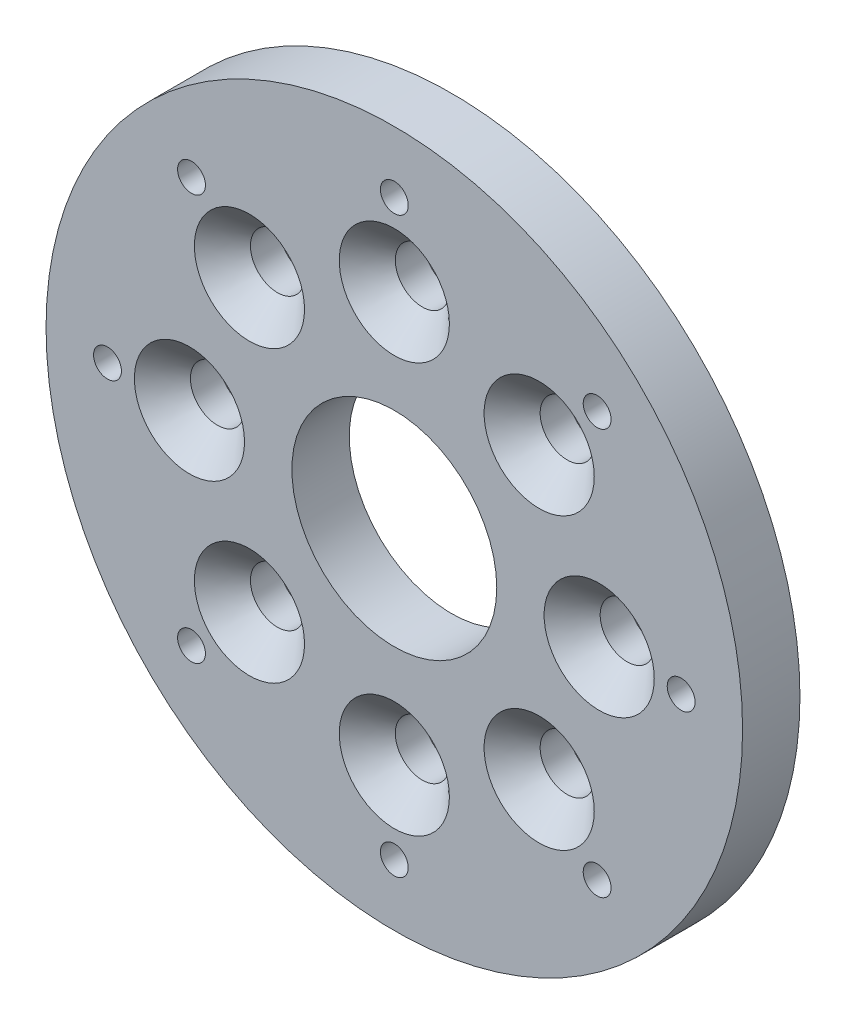
ISO-10303-21;
HEADER;
FILE_DESCRIPTION(('STEP AP214'),'2;1');
FILE_NAME('part.step','',(''),(''),'','','');
FILE_SCHEMA(('AUTOMOTIVE_DESIGN { 1 0 10303 214 1 1 1 1 }'));
ENDSEC;
DATA;
#1=APPLICATION_CONTEXT('core data for automotive mechanical design processes');
#2=APPLICATION_PROTOCOL_DEFINITION('international standard','automotive_design',2000,#1);
#3=PRODUCT_CONTEXT('',#1,'mechanical');
#4=PRODUCT('Part','Part','',(#3));
#5=PRODUCT_RELATED_PRODUCT_CATEGORY('part','',(#4));
#6=PRODUCT_DEFINITION_FORMATION('','',#4);
#7=PRODUCT_DEFINITION_CONTEXT('part definition',#1,'design');
#8=PRODUCT_DEFINITION('design','',#6,#7);
#9=PRODUCT_DEFINITION_SHAPE('','',#8);
#10=(LENGTH_UNIT() NAMED_UNIT(*) SI_UNIT(.MILLI.,.METRE.));
#11=(NAMED_UNIT(*) PLANE_ANGLE_UNIT() SI_UNIT($,.RADIAN.));
#12=(NAMED_UNIT(*) SI_UNIT($,.STERADIAN.) SOLID_ANGLE_UNIT());
#13=UNCERTAINTY_MEASURE_WITH_UNIT(LENGTH_MEASURE(1.E-05),#10,'distance_accuracy_value','');
#14=(GEOMETRIC_REPRESENTATION_CONTEXT(3) GLOBAL_UNCERTAINTY_ASSIGNED_CONTEXT((#13)) GLOBAL_UNIT_ASSIGNED_CONTEXT((#10,
#11,#12)) REPRESENTATION_CONTEXT('',''));
#15=CARTESIAN_POINT('',(0.,0.,0.));
#16=DIRECTION('',(0.,0.,1.));
#17=DIRECTION('',(1.,0.,0.));
#18=AXIS2_PLACEMENT_3D('',#15,#16,#17);
#19=CARTESIAN_POINT('',(0.,0.,7.));
#20=DIRECTION('',(0.,0.,1.));
#21=DIRECTION('',(1.,0.,0.));
#22=AXIS2_PLACEMENT_3D('',#19,#20,#21);
#23=PLANE('',#22);
#24=CARTESIAN_POINT('',(0.,35.,7.));
#25=DIRECTION('',(0.,0.,1.));
#26=DIRECTION('',(1.,0.,0.));
#27=AXIS2_PLACEMENT_3D('',#24,#25,#26);
#28=CIRCLE('',#27,1.7);
#29=CARTESIAN_POINT('',(1.7,35.,7.));
#30=VERTEX_POINT('',#29);
#31=EDGE_CURVE('E34',#30,#30,#28,.T.);
#32=ORIENTED_EDGE('',*,*,#31,.F.);
#33=EDGE_LOOP('',(#32));
#34=FACE_BOUND('',#33,.T.);
#35=CARTESIAN_POINT('',(-24.7487373415292,24.7487373415292,7.));
#36=DIRECTION('',(0.,0.,1.));
#37=DIRECTION('',(1.,0.,0.));
#38=AXIS2_PLACEMENT_3D('',#35,#36,#37);
#39=CIRCLE('',#38,1.7);
#40=CARTESIAN_POINT('',(-23.0487373415292,24.7487373415292,7.));
#41=VERTEX_POINT('',#40);
#42=EDGE_CURVE('E117',#41,#41,#39,.T.);
#43=ORIENTED_EDGE('',*,*,#42,.F.);
#44=EDGE_LOOP('',(#43));
#45=FACE_BOUND('',#44,.T.);
#46=CARTESIAN_POINT('',(-35.,0.,7.));
#47=DIRECTION('',(0.,0.,1.));
#48=DIRECTION('',(1.,0.,0.));
#49=AXIS2_PLACEMENT_3D('',#46,#47,#48);
#50=CIRCLE('',#49,1.7);
#51=CARTESIAN_POINT('',(-33.3,0.,7.));
#52=VERTEX_POINT('',#51);
#53=EDGE_CURVE('E113',#52,#52,#50,.T.);
#54=ORIENTED_EDGE('',*,*,#53,.F.);
#55=EDGE_LOOP('',(#54));
#56=FACE_BOUND('',#55,.T.);
#57=CARTESIAN_POINT('',(-24.7487373415292,-24.7487373415292,7.));
#58=DIRECTION('',(0.,0.,1.));
#59=DIRECTION('',(1.,0.,0.));
#60=AXIS2_PLACEMENT_3D('',#57,#58,#59);
#61=CIRCLE('',#60,1.7);
#62=CARTESIAN_POINT('',(-23.0487373415292,-24.7487373415292,7.));
#63=VERTEX_POINT('',#62);
#64=EDGE_CURVE('E108',#63,#63,#61,.T.);
#65=ORIENTED_EDGE('',*,*,#64,.F.);
#66=EDGE_LOOP('',(#65));
#67=FACE_BOUND('',#66,.T.);
#68=CARTESIAN_POINT('',(0.,-35.,7.));
#69=DIRECTION('',(0.,0.,1.));
#70=DIRECTION('',(1.,0.,0.));
#71=AXIS2_PLACEMENT_3D('',#68,#69,#70);
#72=CIRCLE('',#71,1.7);
#73=CARTESIAN_POINT('',(1.7,-35.,7.));
#74=VERTEX_POINT('',#73);
#75=EDGE_CURVE('E103',#74,#74,#72,.T.);
#76=ORIENTED_EDGE('',*,*,#75,.F.);
#77=EDGE_LOOP('',(#76));
#78=FACE_BOUND('',#77,.T.);
#79=CARTESIAN_POINT('',(24.7487373415292,-24.7487373415292,7.));
#80=DIRECTION('',(0.,0.,1.));
#81=DIRECTION('',(1.,0.,0.));
#82=AXIS2_PLACEMENT_3D('',#79,#80,#81);
#83=CIRCLE('',#82,1.7);
#84=CARTESIAN_POINT('',(26.4487373415292,-24.7487373415292,7.));
#85=VERTEX_POINT('',#84);
#86=EDGE_CURVE('E98',#85,#85,#83,.T.);
#87=ORIENTED_EDGE('',*,*,#86,.F.);
#88=EDGE_LOOP('',(#87));
#89=FACE_BOUND('',#88,.T.);
#90=CARTESIAN_POINT('',(35.,0.,7.));
#91=DIRECTION('',(0.,0.,1.));
#92=DIRECTION('',(1.,0.,0.));
#93=AXIS2_PLACEMENT_3D('',#90,#91,#92);
#94=CIRCLE('',#93,1.7);
#95=CARTESIAN_POINT('',(36.7,0.,7.));
#96=VERTEX_POINT('',#95);
#97=EDGE_CURVE('E93',#96,#96,#94,.T.);
#98=ORIENTED_EDGE('',*,*,#97,.F.);
#99=EDGE_LOOP('',(#98));
#100=FACE_BOUND('',#99,.T.);
#101=CARTESIAN_POINT('',(24.7487373415292,24.7487373415292,7.));
#102=DIRECTION('',(0.,0.,1.));
#103=DIRECTION('',(1.,0.,0.));
#104=AXIS2_PLACEMENT_3D('',#101,#102,#103);
#105=CIRCLE('',#104,1.7);
#106=CARTESIAN_POINT('',(26.4487373415292,24.7487373415292,7.));
#107=VERTEX_POINT('',#106);
#108=EDGE_CURVE('E88',#107,#107,#105,.T.);
#109=ORIENTED_EDGE('',*,*,#108,.F.);
#110=EDGE_LOOP('',(#109));
#111=FACE_BOUND('',#110,.T.);
#112=CARTESIAN_POINT('',(0.,25.,7.));
#113=DIRECTION('',(0.,0.,1.));
#114=DIRECTION('',(1.,0.,0.));
#115=AXIS2_PLACEMENT_3D('',#112,#113,#114);
#116=CIRCLE('',#115,6.72);
#117=CARTESIAN_POINT('',(6.72,25.,7.));
#118=VERTEX_POINT('',#117);
#119=EDGE_CURVE('E91',#118,#118,#116,.T.);
#120=ORIENTED_EDGE('',*,*,#119,.F.);
#121=EDGE_LOOP('',(#120));
#122=FACE_BOUND('',#121,.T.);
#123=CARTESIAN_POINT('',(17.6776695296637,17.6776695296637,7.));
#124=DIRECTION('',(0.,0.,1.));
#125=DIRECTION('',(1.,0.,0.));
#126=AXIS2_PLACEMENT_3D('',#123,#124,#125);
#127=CIRCLE('',#126,6.72);
#128=CARTESIAN_POINT('',(24.3976695296637,17.6776695296637,7.));
#129=VERTEX_POINT('',#128);
#130=EDGE_CURVE('E86',#129,#129,#127,.T.);
#131=ORIENTED_EDGE('',*,*,#130,.F.);
#132=EDGE_LOOP('',(#131));
#133=FACE_BOUND('',#132,.T.);
#134=CARTESIAN_POINT('',(25.,0.,7.));
#135=DIRECTION('',(0.,0.,1.));
#136=DIRECTION('',(1.,0.,0.));
#137=AXIS2_PLACEMENT_3D('',#134,#135,#136);
#138=CIRCLE('',#137,6.72);
#139=CARTESIAN_POINT('',(31.72,0.,7.));
#140=VERTEX_POINT('',#139);
#141=EDGE_CURVE('E81',#140,#140,#138,.T.);
#142=ORIENTED_EDGE('',*,*,#141,.F.);
#143=EDGE_LOOP('',(#142));
#144=FACE_BOUND('',#143,.T.);
#145=CARTESIAN_POINT('',(17.6776695296637,-17.6776695296637,7.));
#146=DIRECTION('',(0.,0.,1.));
#147=DIRECTION('',(1.,0.,0.));
#148=AXIS2_PLACEMENT_3D('',#145,#146,#147);
#149=CIRCLE('',#148,6.72);
#150=CARTESIAN_POINT('',(24.3976695296637,-17.6776695296637,7.));
#151=VERTEX_POINT('',#150);
#152=EDGE_CURVE('E76',#151,#151,#149,.T.);
#153=ORIENTED_EDGE('',*,*,#152,.F.);
#154=EDGE_LOOP('',(#153));
#155=FACE_BOUND('',#154,.T.);
#156=CARTESIAN_POINT('',(0.,-25.,7.));
#157=DIRECTION('',(0.,0.,1.));
#158=DIRECTION('',(1.,0.,0.));
#159=AXIS2_PLACEMENT_3D('',#156,#157,#158);
#160=CIRCLE('',#159,6.72);
#161=CARTESIAN_POINT('',(6.72,-25.,7.));
#162=VERTEX_POINT('',#161);
#163=EDGE_CURVE('E71',#162,#162,#160,.T.);
#164=ORIENTED_EDGE('',*,*,#163,.F.);
#165=EDGE_LOOP('',(#164));
#166=FACE_BOUND('',#165,.T.);
#167=CARTESIAN_POINT('',(-17.6776695296637,-17.6776695296637,7.));
#168=DIRECTION('',(0.,0.,1.));
#169=DIRECTION('',(1.,0.,0.));
#170=AXIS2_PLACEMENT_3D('',#167,#168,#169);
#171=CIRCLE('',#170,6.72);
#172=CARTESIAN_POINT('',(-10.9576695296637,-17.6776695296637,7.));
#173=VERTEX_POINT('',#172);
#174=EDGE_CURVE('E66',#173,#173,#171,.T.);
#175=ORIENTED_EDGE('',*,*,#174,.F.);
#176=EDGE_LOOP('',(#175));
#177=FACE_BOUND('',#176,.T.);
#178=CARTESIAN_POINT('',(-25.,0.,7.));
#179=DIRECTION('',(0.,0.,1.));
#180=DIRECTION('',(1.,0.,0.));
#181=AXIS2_PLACEMENT_3D('',#178,#179,#180);
#182=CIRCLE('',#181,6.72);
#183=CARTESIAN_POINT('',(-18.28,0.,7.));
#184=VERTEX_POINT('',#183);
#185=EDGE_CURVE('E61',#184,#184,#182,.T.);
#186=ORIENTED_EDGE('',*,*,#185,.F.);
#187=EDGE_LOOP('',(#186));
#188=FACE_BOUND('',#187,.T.);
#189=CARTESIAN_POINT('',(-17.6776695296637,17.6776695296637,7.));
#190=DIRECTION('',(0.,0.,1.));
#191=DIRECTION('',(1.,0.,0.));
#192=AXIS2_PLACEMENT_3D('',#189,#190,#191);
#193=CIRCLE('',#192,6.72);
#194=CARTESIAN_POINT('',(-10.9576695296637,17.6776695296637,7.));
#195=VERTEX_POINT('',#194);
#196=EDGE_CURVE('E56',#195,#195,#193,.T.);
#197=ORIENTED_EDGE('',*,*,#196,.F.);
#198=EDGE_LOOP('',(#197));
#199=FACE_BOUND('',#198,.T.);
#200=CARTESIAN_POINT('',(0.,0.,7.));
#201=DIRECTION('',(0.,0.,1.));
#202=DIRECTION('',(1.,0.,0.));
#203=AXIS2_PLACEMENT_3D('',#200,#201,#202);
#204=CIRCLE('',#203,42.5);
#205=CARTESIAN_POINT('',(42.5,0.,7.));
#206=VERTEX_POINT('',#205);
#207=EDGE_CURVE('E10',#206,#206,#204,.T.);
#208=ORIENTED_EDGE('',*,*,#207,.T.);
#209=EDGE_LOOP('',(#208));
#210=FACE_BOUND('',#209,.T.);
#211=CARTESIAN_POINT('',(0.,0.,7.));
#212=DIRECTION('',(0.,0.,1.));
#213=DIRECTION('',(1.,0.,0.));
#214=AXIS2_PLACEMENT_3D('',#211,#212,#213);
#215=CIRCLE('',#214,12.5);
#216=CARTESIAN_POINT('',(12.5,0.,7.));
#217=VERTEX_POINT('',#216);
#218=EDGE_CURVE('E43',#217,#217,#215,.T.);
#219=ORIENTED_EDGE('',*,*,#218,.F.);
#220=EDGE_LOOP('',(#219));
#221=FACE_BOUND('',#220,.T.);
#222=ADVANCED_FACE('F30',(#34,#45,#56,#67,#78,#89,#100,#111,#122,#133,#144,#155,#166,#177,#188,
#199,#210,#221),#23,.T.);
#223=CARTESIAN_POINT('',(0.,0.,0.));
#224=DIRECTION('',(0.,0.,1.));
#225=DIRECTION('',(1.,0.,0.));
#226=AXIS2_PLACEMENT_3D('',#223,#224,#225);
#227=PLANE('',#226);
#228=CARTESIAN_POINT('',(0.,35.,0.));
#229=DIRECTION('',(0.,0.,-1.));
#230=DIRECTION('',(-1.,0.,0.));
#231=AXIS2_PLACEMENT_3D('',#228,#229,#230);
#232=CIRCLE('',#231,3.5);
#233=CARTESIAN_POINT('',(-3.5,35.,0.));
#234=VERTEX_POINT('',#233);
#235=EDGE_CURVE('E431',#234,#234,#232,.T.);
#236=ORIENTED_EDGE('',*,*,#235,.F.);
#237=EDGE_LOOP('',(#236));
#238=FACE_BOUND('',#237,.T.);
#239=CARTESIAN_POINT('',(-24.7487373415292,24.7487373415292,0.));
#240=DIRECTION('',(0.,0.,-1.));
#241=DIRECTION('',(-1.,0.,0.));
#242=AXIS2_PLACEMENT_3D('',#239,#240,#241);
#243=CIRCLE('',#242,3.5);
#244=CARTESIAN_POINT('',(-28.2487373415292,24.7487373415292,0.));
#245=VERTEX_POINT('',#244);
#246=EDGE_CURVE('E132',#245,#245,#243,.T.);
#247=ORIENTED_EDGE('',*,*,#246,.F.);
#248=EDGE_LOOP('',(#247));
#249=FACE_BOUND('',#248,.T.);
#250=CARTESIAN_POINT('',(-35.,0.,0.));
#251=DIRECTION('',(0.,0.,-1.));
#252=DIRECTION('',(-1.,0.,0.));
#253=AXIS2_PLACEMENT_3D('',#250,#251,#252);
#254=CIRCLE('',#253,3.5);
#255=CARTESIAN_POINT('',(-38.5,0.,0.));
#256=VERTEX_POINT('',#255);
#257=EDGE_CURVE('E119',#256,#256,#254,.T.);
#258=ORIENTED_EDGE('',*,*,#257,.F.);
#259=EDGE_LOOP('',(#258));
#260=FACE_BOUND('',#259,.T.);
#261=CARTESIAN_POINT('',(-24.7487373415292,-24.7487373415292,0.));
#262=DIRECTION('',(0.,0.,-1.));
#263=DIRECTION('',(-1.,0.,0.));
#264=AXIS2_PLACEMENT_3D('',#261,#262,#263);
#265=CIRCLE('',#264,3.5);
#266=CARTESIAN_POINT('',(-28.2487373415292,-24.7487373415292,0.));
#267=VERTEX_POINT('',#266);
#268=EDGE_CURVE('E115',#267,#267,#265,.T.);
#269=ORIENTED_EDGE('',*,*,#268,.F.);
#270=EDGE_LOOP('',(#269));
#271=FACE_BOUND('',#270,.T.);
#272=CARTESIAN_POINT('',(0.,-35.,0.));
#273=DIRECTION('',(0.,0.,-1.));
#274=DIRECTION('',(-1.,0.,0.));
#275=AXIS2_PLACEMENT_3D('',#272,#273,#274);
#276=CIRCLE('',#275,3.5);
#277=CARTESIAN_POINT('',(-3.5,-35.,0.));
#278=VERTEX_POINT('',#277);
#279=EDGE_CURVE('E111',#278,#278,#276,.T.);
#280=ORIENTED_EDGE('',*,*,#279,.F.);
#281=EDGE_LOOP('',(#280));
#282=FACE_BOUND('',#281,.T.);
#283=CARTESIAN_POINT('',(24.7487373415292,-24.7487373415292,0.));
#284=DIRECTION('',(0.,0.,-1.));
#285=DIRECTION('',(-1.,0.,0.));
#286=AXIS2_PLACEMENT_3D('',#283,#284,#285);
#287=CIRCLE('',#286,3.5);
#288=CARTESIAN_POINT('',(21.2487373415292,-24.7487373415292,0.));
#289=VERTEX_POINT('',#288);
#290=EDGE_CURVE('E106',#289,#289,#287,.T.);
#291=ORIENTED_EDGE('',*,*,#290,.F.);
#292=EDGE_LOOP('',(#291));
#293=FACE_BOUND('',#292,.T.);
#294=CARTESIAN_POINT('',(35.,0.,0.));
#295=DIRECTION('',(0.,0.,-1.));
#296=DIRECTION('',(-1.,0.,0.));
#297=AXIS2_PLACEMENT_3D('',#294,#295,#296);
#298=CIRCLE('',#297,3.5);
#299=CARTESIAN_POINT('',(31.5,0.,0.));
#300=VERTEX_POINT('',#299);
#301=EDGE_CURVE('E101',#300,#300,#298,.T.);
#302=ORIENTED_EDGE('',*,*,#301,.F.);
#303=EDGE_LOOP('',(#302));
#304=FACE_BOUND('',#303,.T.);
#305=CARTESIAN_POINT('',(24.7487373415292,24.7487373415292,0.));
#306=DIRECTION('',(0.,0.,-1.));
#307=DIRECTION('',(-1.,0.,0.));
#308=AXIS2_PLACEMENT_3D('',#305,#306,#307);
#309=CIRCLE('',#308,3.5);
#310=CARTESIAN_POINT('',(21.2487373415292,24.7487373415292,0.));
#311=VERTEX_POINT('',#310);
#312=EDGE_CURVE('E96',#311,#311,#309,.T.);
#313=ORIENTED_EDGE('',*,*,#312,.F.);
#314=EDGE_LOOP('',(#313));
#315=FACE_BOUND('',#314,.T.);
#316=CARTESIAN_POINT('',(0.,25.,0.));
#317=DIRECTION('',(0.,0.,1.));
#318=DIRECTION('',(1.,0.,0.));
#319=AXIS2_PLACEMENT_3D('',#316,#317,#318);
#320=CIRCLE('',#319,3.29999999999999);
#321=CARTESIAN_POINT('',(3.29999999999999,25.,0.));
#322=VERTEX_POINT('',#321);
#323=EDGE_CURVE('E83',#322,#322,#320,.T.);
#324=ORIENTED_EDGE('',*,*,#323,.T.);
#325=EDGE_LOOP('',(#324));
#326=FACE_BOUND('',#325,.T.);
#327=CARTESIAN_POINT('',(17.6776695296637,17.6776695296637,0.));
#328=DIRECTION('',(0.,0.,1.));
#329=DIRECTION('',(1.,0.,0.));
#330=AXIS2_PLACEMENT_3D('',#327,#328,#329);
#331=CIRCLE('',#330,3.29999999999999);
#332=CARTESIAN_POINT('',(20.9776695296637,17.6776695296637,0.));
#333=VERTEX_POINT('',#332);
#334=EDGE_CURVE('E78',#333,#333,#331,.T.);
#335=ORIENTED_EDGE('',*,*,#334,.T.);
#336=EDGE_LOOP('',(#335));
#337=FACE_BOUND('',#336,.T.);
#338=CARTESIAN_POINT('',(25.,0.,0.));
#339=DIRECTION('',(0.,0.,1.));
#340=DIRECTION('',(1.,0.,0.));
#341=AXIS2_PLACEMENT_3D('',#338,#339,#340);
#342=CIRCLE('',#341,3.29999999999999);
#343=CARTESIAN_POINT('',(28.3,0.,0.));
#344=VERTEX_POINT('',#343);
#345=EDGE_CURVE('E73',#344,#344,#342,.T.);
#346=ORIENTED_EDGE('',*,*,#345,.T.);
#347=EDGE_LOOP('',(#346));
#348=FACE_BOUND('',#347,.T.);
#349=CARTESIAN_POINT('',(17.6776695296637,-17.6776695296637,0.));
#350=DIRECTION('',(0.,0.,1.));
#351=DIRECTION('',(1.,0.,0.));
#352=AXIS2_PLACEMENT_3D('',#349,#350,#351);
#353=CIRCLE('',#352,3.29999999999999);
#354=CARTESIAN_POINT('',(20.9776695296637,-17.6776695296637,0.));
#355=VERTEX_POINT('',#354);
#356=EDGE_CURVE('E68',#355,#355,#353,.T.);
#357=ORIENTED_EDGE('',*,*,#356,.T.);
#358=EDGE_LOOP('',(#357));
#359=FACE_BOUND('',#358,.T.);
#360=CARTESIAN_POINT('',(0.,-25.,0.));
#361=DIRECTION('',(0.,0.,1.));
#362=DIRECTION('',(1.,0.,0.));
#363=AXIS2_PLACEMENT_3D('',#360,#361,#362);
#364=CIRCLE('',#363,3.29999999999999);
#365=CARTESIAN_POINT('',(3.29999999999999,-25.,0.));
#366=VERTEX_POINT('',#365);
#367=EDGE_CURVE('E63',#366,#366,#364,.T.);
#368=ORIENTED_EDGE('',*,*,#367,.T.);
#369=EDGE_LOOP('',(#368));
#370=FACE_BOUND('',#369,.T.);
#371=CARTESIAN_POINT('',(-17.6776695296637,-17.6776695296637,0.));
#372=DIRECTION('',(0.,0.,1.));
#373=DIRECTION('',(1.,0.,0.));
#374=AXIS2_PLACEMENT_3D('',#371,#372,#373);
#375=CIRCLE('',#374,3.29999999999999);
#376=CARTESIAN_POINT('',(-14.3776695296637,-17.6776695296637,0.));
#377=VERTEX_POINT('',#376);
#378=EDGE_CURVE('E58',#377,#377,#375,.T.);
#379=ORIENTED_EDGE('',*,*,#378,.T.);
#380=EDGE_LOOP('',(#379));
#381=FACE_BOUND('',#380,.T.);
#382=CARTESIAN_POINT('',(-25.,0.,0.));
#383=DIRECTION('',(0.,0.,1.));
#384=DIRECTION('',(1.,0.,0.));
#385=AXIS2_PLACEMENT_3D('',#382,#383,#384);
#386=CIRCLE('',#385,3.29999999999999);
#387=CARTESIAN_POINT('',(-21.7,0.,0.));
#388=VERTEX_POINT('',#387);
#389=EDGE_CURVE('E53',#388,#388,#386,.T.);
#390=ORIENTED_EDGE('',*,*,#389,.T.);
#391=EDGE_LOOP('',(#390));
#392=FACE_BOUND('',#391,.T.);
#393=CARTESIAN_POINT('',(-17.6776695296637,17.6776695296637,0.));
#394=DIRECTION('',(0.,0.,1.));
#395=DIRECTION('',(1.,0.,0.));
#396=AXIS2_PLACEMENT_3D('',#393,#394,#395);
#397=CIRCLE('',#396,3.29999999999999);
#398=CARTESIAN_POINT('',(-14.3776695296637,17.6776695296637,0.));
#399=VERTEX_POINT('',#398);
#400=EDGE_CURVE('E49',#399,#399,#397,.T.);
#401=ORIENTED_EDGE('',*,*,#400,.T.);
#402=EDGE_LOOP('',(#401));
#403=FACE_BOUND('',#402,.T.);
#404=CARTESIAN_POINT('',(0.,0.,0.));
#405=DIRECTION('',(0.,0.,1.));
#406=DIRECTION('',(1.,0.,0.));
#407=AXIS2_PLACEMENT_3D('',#404,#405,#406);
#408=CIRCLE('',#407,42.5);
#409=CARTESIAN_POINT('',(42.5,0.,0.));
#410=VERTEX_POINT('',#409);
#411=EDGE_CURVE('E38',#410,#410,#408,.T.);
#412=ORIENTED_EDGE('',*,*,#411,.F.);
#413=EDGE_LOOP('',(#412));
#414=FACE_BOUND('',#413,.T.);
#415=CARTESIAN_POINT('',(0.,0.,0.));
#416=DIRECTION('',(0.,0.,1.));
#417=DIRECTION('',(1.,0.,0.));
#418=AXIS2_PLACEMENT_3D('',#415,#416,#417);
#419=CIRCLE('',#418,12.5);
#420=CARTESIAN_POINT('',(12.5,0.,0.));
#421=VERTEX_POINT('',#420);
#422=EDGE_CURVE('E46',#421,#421,#419,.T.);
#423=ORIENTED_EDGE('',*,*,#422,.T.);
#424=EDGE_LOOP('',(#423));
#425=FACE_BOUND('',#424,.T.);
#426=ADVANCED_FACE('F212',(#238,#249,#260,#271,#282,#293,#304,#315,#326,#337,#348,#359,#370,
#381,#392,#403,#414,#425),#227,.F.);
#427=CARTESIAN_POINT('',(0.,0.,7.));
#428=DIRECTION('',(0.,0.,-1.));
#429=DIRECTION('',(-1.,0.,0.));
#430=AXIS2_PLACEMENT_3D('',#427,#428,#429);
#431=CYLINDRICAL_SURFACE('',#430,42.5);
#432=ORIENTED_EDGE('',*,*,#207,.F.);
#433=EDGE_LOOP('',(#432));
#434=FACE_BOUND('',#433,.T.);
#435=ORIENTED_EDGE('',*,*,#411,.T.);
#436=EDGE_LOOP('',(#435));
#437=FACE_BOUND('',#436,.T.);
#438=ADVANCED_FACE('F32',(#434,#437),#431,.T.);
#439=CARTESIAN_POINT('',(0.,0.,7.));
#440=DIRECTION('',(0.,0.,-1.));
#441=DIRECTION('',(-1.,0.,0.));
#442=AXIS2_PLACEMENT_3D('',#439,#440,#441);
#443=CYLINDRICAL_SURFACE('',#442,12.5);
#444=ORIENTED_EDGE('',*,*,#218,.T.);
#445=EDGE_LOOP('',(#444));
#446=FACE_BOUND('',#445,.T.);
#447=ORIENTED_EDGE('',*,*,#422,.F.);
#448=EDGE_LOOP('',(#447));
#449=FACE_BOUND('',#448,.T.);
#450=ADVANCED_FACE('F214',(#446,#449),#443,.F.);
#451=CARTESIAN_POINT('',(-17.6776695296637,17.6776695296637,7.));
#452=DIRECTION('',(0.,0.,1.));
#453=DIRECTION('',(1.,0.,0.));
#454=AXIS2_PLACEMENT_3D('',#451,#452,#453);
#455=CYLINDRICAL_SURFACE('',#454,3.29999999999999);
#456=CARTESIAN_POINT('',(-17.6776695296637,17.6776695296637,3.58));
#457=DIRECTION('',(0.,0.,1.));
#458=DIRECTION('',(1.,0.,0.));
#459=AXIS2_PLACEMENT_3D('',#456,#457,#458);
#460=CIRCLE('',#459,3.3);
#461=CARTESIAN_POINT('',(-14.3776695296637,17.6776695296637,3.58));
#462=VERTEX_POINT('',#461);
#463=EDGE_CURVE('E52',#462,#462,#460,.T.);
#464=ORIENTED_EDGE('',*,*,#463,.T.);
#465=EDGE_LOOP('',(#464));
#466=FACE_BOUND('',#465,.T.);
#467=ORIENTED_EDGE('',*,*,#400,.F.);
#468=EDGE_LOOP('',(#467));
#469=FACE_BOUND('',#468,.T.);
#470=ADVANCED_FACE('F216',(#466,#469),#455,.F.);
#471=CARTESIAN_POINT('',(-17.6776695296637,17.6776695296637,7.));
#472=DIRECTION('',(0.,0.,1.));
#473=DIRECTION('',(1.,0.,0.));
#474=AXIS2_PLACEMENT_3D('',#471,#472,#473);
#475=CONICAL_SURFACE('',#474,6.72,0.785398163397449);
#476=ORIENTED_EDGE('',*,*,#463,.F.);
#477=EDGE_LOOP('',(#476));
#478=FACE_BOUND('',#477,.T.);
#479=ORIENTED_EDGE('',*,*,#196,.T.);
#480=EDGE_LOOP('',(#479));
#481=FACE_BOUND('',#480,.T.);
#482=ADVANCED_FACE('F222',(#478,#481),#475,.F.);
#483=CARTESIAN_POINT('',(-25.,0.,7.));
#484=DIRECTION('',(0.,0.,1.));
#485=DIRECTION('',(1.,0.,0.));
#486=AXIS2_PLACEMENT_3D('',#483,#484,#485);
#487=CYLINDRICAL_SURFACE('',#486,3.29999999999999);
#488=CARTESIAN_POINT('',(-25.,0.,3.58));
#489=DIRECTION('',(0.,0.,1.));
#490=DIRECTION('',(1.,0.,0.));
#491=AXIS2_PLACEMENT_3D('',#488,#489,#490);
#492=CIRCLE('',#491,3.3);
#493=CARTESIAN_POINT('',(-21.7,0.,3.58));
#494=VERTEX_POINT('',#493);
#495=EDGE_CURVE('E57',#494,#494,#492,.T.);
#496=ORIENTED_EDGE('',*,*,#495,.T.);
#497=EDGE_LOOP('',(#496));
#498=FACE_BOUND('',#497,.T.);
#499=ORIENTED_EDGE('',*,*,#389,.F.);
#500=EDGE_LOOP('',(#499));
#501=FACE_BOUND('',#500,.T.);
#502=ADVANCED_FACE('F267',(#498,#501),#487,.F.);
#503=CARTESIAN_POINT('',(-25.,0.,7.));
#504=DIRECTION('',(0.,0.,1.));
#505=DIRECTION('',(1.,0.,0.));
#506=AXIS2_PLACEMENT_3D('',#503,#504,#505);
#507=CONICAL_SURFACE('',#506,6.72,0.785398163397449);
#508=ORIENTED_EDGE('',*,*,#495,.F.);
#509=EDGE_LOOP('',(#508));
#510=FACE_BOUND('',#509,.T.);
#511=ORIENTED_EDGE('',*,*,#185,.T.);
#512=EDGE_LOOP('',(#511));
#513=FACE_BOUND('',#512,.T.);
#514=ADVANCED_FACE('F273',(#510,#513),#507,.F.);
#515=CARTESIAN_POINT('',(-17.6776695296637,-17.6776695296637,7.));
#516=DIRECTION('',(0.,0.,1.));
#517=DIRECTION('',(1.,0.,0.));
#518=AXIS2_PLACEMENT_3D('',#515,#516,#517);
#519=CYLINDRICAL_SURFACE('',#518,3.29999999999999);
#520=CARTESIAN_POINT('',(-17.6776695296637,-17.6776695296637,3.58));
#521=DIRECTION('',(0.,0.,1.));
#522=DIRECTION('',(1.,0.,0.));
#523=AXIS2_PLACEMENT_3D('',#520,#521,#522);
#524=CIRCLE('',#523,3.3);
#525=CARTESIAN_POINT('',(-14.3776695296637,-17.6776695296637,3.58));
#526=VERTEX_POINT('',#525);
#527=EDGE_CURVE('E62',#526,#526,#524,.T.);
#528=ORIENTED_EDGE('',*,*,#527,.T.);
#529=EDGE_LOOP('',(#528));
#530=FACE_BOUND('',#529,.T.);
#531=ORIENTED_EDGE('',*,*,#378,.F.);
#532=EDGE_LOOP('',(#531));
#533=FACE_BOUND('',#532,.T.);
#534=ADVANCED_FACE('F280',(#530,#533),#519,.F.);
#535=CARTESIAN_POINT('',(-17.6776695296637,-17.6776695296637,7.));
#536=DIRECTION('',(0.,0.,1.));
#537=DIRECTION('',(1.,0.,0.));
#538=AXIS2_PLACEMENT_3D('',#535,#536,#537);
#539=CONICAL_SURFACE('',#538,6.72,0.785398163397449);
#540=ORIENTED_EDGE('',*,*,#527,.F.);
#541=EDGE_LOOP('',(#540));
#542=FACE_BOUND('',#541,.T.);
#543=ORIENTED_EDGE('',*,*,#174,.T.);
#544=EDGE_LOOP('',(#543));
#545=FACE_BOUND('',#544,.T.);
#546=ADVANCED_FACE('F284',(#542,#545),#539,.F.);
#547=CARTESIAN_POINT('',(0.,-25.,7.));
#548=DIRECTION('',(0.,0.,1.));
#549=DIRECTION('',(1.,0.,0.));
#550=AXIS2_PLACEMENT_3D('',#547,#548,#549);
#551=CYLINDRICAL_SURFACE('',#550,3.29999999999999);
#552=CARTESIAN_POINT('',(0.,-25.,3.58));
#553=DIRECTION('',(0.,0.,1.));
#554=DIRECTION('',(1.,0.,0.));
#555=AXIS2_PLACEMENT_3D('',#552,#553,#554);
#556=CIRCLE('',#555,3.3);
#557=CARTESIAN_POINT('',(3.3,-25.,3.58));
#558=VERTEX_POINT('',#557);
#559=EDGE_CURVE('E67',#558,#558,#556,.T.);
#560=ORIENTED_EDGE('',*,*,#559,.T.);
#561=EDGE_LOOP('',(#560));
#562=FACE_BOUND('',#561,.T.);
#563=ORIENTED_EDGE('',*,*,#367,.F.);
#564=EDGE_LOOP('',(#563));
#565=FACE_BOUND('',#564,.T.);
#566=ADVANCED_FACE('F288',(#562,#565),#551,.F.);
#567=CARTESIAN_POINT('',(0.,-25.,7.));
#568=DIRECTION('',(0.,0.,1.));
#569=DIRECTION('',(1.,0.,0.));
#570=AXIS2_PLACEMENT_3D('',#567,#568,#569);
#571=CONICAL_SURFACE('',#570,6.72,0.785398163397449);
#572=ORIENTED_EDGE('',*,*,#559,.F.);
#573=EDGE_LOOP('',(#572));
#574=FACE_BOUND('',#573,.T.);
#575=ORIENTED_EDGE('',*,*,#163,.T.);
#576=EDGE_LOOP('',(#575));
#577=FACE_BOUND('',#576,.T.);
#578=ADVANCED_FACE('F292',(#574,#577),#571,.F.);
#579=CARTESIAN_POINT('',(17.6776695296637,-17.6776695296637,7.));
#580=DIRECTION('',(0.,0.,1.));
#581=DIRECTION('',(1.,0.,0.));
#582=AXIS2_PLACEMENT_3D('',#579,#580,#581);
#583=CYLINDRICAL_SURFACE('',#582,3.29999999999999);
#584=CARTESIAN_POINT('',(17.6776695296637,-17.6776695296637,3.58));
#585=DIRECTION('',(0.,0.,1.));
#586=DIRECTION('',(1.,0.,0.));
#587=AXIS2_PLACEMENT_3D('',#584,#585,#586);
#588=CIRCLE('',#587,3.3);
#589=CARTESIAN_POINT('',(20.9776695296637,-17.6776695296637,3.58));
#590=VERTEX_POINT('',#589);
#591=EDGE_CURVE('E72',#590,#590,#588,.T.);
#592=ORIENTED_EDGE('',*,*,#591,.T.);
#593=EDGE_LOOP('',(#592));
#594=FACE_BOUND('',#593,.T.);
#595=ORIENTED_EDGE('',*,*,#356,.F.);
#596=EDGE_LOOP('',(#595));
#597=FACE_BOUND('',#596,.T.);
#598=ADVANCED_FACE('F296',(#594,#597),#583,.F.);
#599=CARTESIAN_POINT('',(17.6776695296637,-17.6776695296637,7.));
#600=DIRECTION('',(0.,0.,1.));
#601=DIRECTION('',(1.,0.,0.));
#602=AXIS2_PLACEMENT_3D('',#599,#600,#601);
#603=CONICAL_SURFACE('',#602,6.72,0.785398163397449);
#604=ORIENTED_EDGE('',*,*,#591,.F.);
#605=EDGE_LOOP('',(#604));
#606=FACE_BOUND('',#605,.T.);
#607=ORIENTED_EDGE('',*,*,#152,.T.);
#608=EDGE_LOOP('',(#607));
#609=FACE_BOUND('',#608,.T.);
#610=ADVANCED_FACE('F300',(#606,#609),#603,.F.);
#611=CARTESIAN_POINT('',(25.,0.,7.));
#612=DIRECTION('',(0.,0.,1.));
#613=DIRECTION('',(1.,0.,0.));
#614=AXIS2_PLACEMENT_3D('',#611,#612,#613);
#615=CYLINDRICAL_SURFACE('',#614,3.29999999999999);
#616=CARTESIAN_POINT('',(25.,0.,3.58));
#617=DIRECTION('',(0.,0.,1.));
#618=DIRECTION('',(1.,0.,0.));
#619=AXIS2_PLACEMENT_3D('',#616,#617,#618);
#620=CIRCLE('',#619,3.3);
#621=CARTESIAN_POINT('',(28.3,0.,3.58));
#622=VERTEX_POINT('',#621);
#623=EDGE_CURVE('E77',#622,#622,#620,.T.);
#624=ORIENTED_EDGE('',*,*,#623,.T.);
#625=EDGE_LOOP('',(#624));
#626=FACE_BOUND('',#625,.T.);
#627=ORIENTED_EDGE('',*,*,#345,.F.);
#628=EDGE_LOOP('',(#627));
#629=FACE_BOUND('',#628,.T.);
#630=ADVANCED_FACE('F304',(#626,#629),#615,.F.);
#631=CARTESIAN_POINT('',(25.,0.,7.));
#632=DIRECTION('',(0.,0.,1.));
#633=DIRECTION('',(1.,0.,0.));
#634=AXIS2_PLACEMENT_3D('',#631,#632,#633);
#635=CONICAL_SURFACE('',#634,6.72,0.785398163397448);
#636=ORIENTED_EDGE('',*,*,#623,.F.);
#637=EDGE_LOOP('',(#636));
#638=FACE_BOUND('',#637,.T.);
#639=ORIENTED_EDGE('',*,*,#141,.T.);
#640=EDGE_LOOP('',(#639));
#641=FACE_BOUND('',#640,.T.);
#642=ADVANCED_FACE('F308',(#638,#641),#635,.F.);
#643=CARTESIAN_POINT('',(17.6776695296637,17.6776695296637,7.));
#644=DIRECTION('',(0.,0.,1.));
#645=DIRECTION('',(1.,0.,0.));
#646=AXIS2_PLACEMENT_3D('',#643,#644,#645);
#647=CYLINDRICAL_SURFACE('',#646,3.29999999999999);
#648=CARTESIAN_POINT('',(17.6776695296637,17.6776695296637,3.58));
#649=DIRECTION('',(0.,0.,1.));
#650=DIRECTION('',(1.,0.,0.));
#651=AXIS2_PLACEMENT_3D('',#648,#649,#650);
#652=CIRCLE('',#651,3.3);
#653=CARTESIAN_POINT('',(20.9776695296637,17.6776695296637,3.58));
#654=VERTEX_POINT('',#653);
#655=EDGE_CURVE('E82',#654,#654,#652,.T.);
#656=ORIENTED_EDGE('',*,*,#655,.T.);
#657=EDGE_LOOP('',(#656));
#658=FACE_BOUND('',#657,.T.);
#659=ORIENTED_EDGE('',*,*,#334,.F.);
#660=EDGE_LOOP('',(#659));
#661=FACE_BOUND('',#660,.T.);
#662=ADVANCED_FACE('F312',(#658,#661),#647,.F.);
#663=CARTESIAN_POINT('',(17.6776695296637,17.6776695296637,7.));
#664=DIRECTION('',(0.,0.,1.));
#665=DIRECTION('',(1.,0.,0.));
#666=AXIS2_PLACEMENT_3D('',#663,#664,#665);
#667=CONICAL_SURFACE('',#666,6.72,0.785398163397449);
#668=ORIENTED_EDGE('',*,*,#655,.F.);
#669=EDGE_LOOP('',(#668));
#670=FACE_BOUND('',#669,.T.);
#671=ORIENTED_EDGE('',*,*,#130,.T.);
#672=EDGE_LOOP('',(#671));
#673=FACE_BOUND('',#672,.T.);
#674=ADVANCED_FACE('F316',(#670,#673),#667,.F.);
#675=CARTESIAN_POINT('',(0.,25.,7.));
#676=DIRECTION('',(0.,0.,1.));
#677=DIRECTION('',(1.,0.,0.));
#678=AXIS2_PLACEMENT_3D('',#675,#676,#677);
#679=CYLINDRICAL_SURFACE('',#678,3.29999999999999);
#680=CARTESIAN_POINT('',(0.,25.,3.58));
#681=DIRECTION('',(0.,0.,1.));
#682=DIRECTION('',(1.,0.,0.));
#683=AXIS2_PLACEMENT_3D('',#680,#681,#682);
#684=CIRCLE('',#683,3.3);
#685=CARTESIAN_POINT('',(3.3,25.,3.58));
#686=VERTEX_POINT('',#685);
#687=EDGE_CURVE('E87',#686,#686,#684,.T.);
#688=ORIENTED_EDGE('',*,*,#687,.T.);
#689=EDGE_LOOP('',(#688));
#690=FACE_BOUND('',#689,.T.);
#691=ORIENTED_EDGE('',*,*,#323,.F.);
#692=EDGE_LOOP('',(#691));
#693=FACE_BOUND('',#692,.T.);
#694=ADVANCED_FACE('F320',(#690,#693),#679,.F.);
#695=CARTESIAN_POINT('',(0.,25.,7.));
#696=DIRECTION('',(0.,0.,1.));
#697=DIRECTION('',(1.,0.,0.));
#698=AXIS2_PLACEMENT_3D('',#695,#696,#697);
#699=CONICAL_SURFACE('',#698,6.72,0.785398163397449);
#700=ORIENTED_EDGE('',*,*,#687,.F.);
#701=EDGE_LOOP('',(#700));
#702=FACE_BOUND('',#701,.T.);
#703=ORIENTED_EDGE('',*,*,#119,.T.);
#704=EDGE_LOOP('',(#703));
#705=FACE_BOUND('',#704,.T.);
#706=ADVANCED_FACE('F324',(#702,#705),#699,.F.);
#707=CARTESIAN_POINT('',(24.7487373415292,24.7487373415292,0.));
#708=DIRECTION('',(0.,0.,-1.));
#709=DIRECTION('',(-1.,0.,0.));
#710=AXIS2_PLACEMENT_3D('',#707,#708,#709);
#711=CYLINDRICAL_SURFACE('',#710,1.7);
#712=ORIENTED_EDGE('',*,*,#108,.T.);
#713=EDGE_LOOP('',(#712));
#714=FACE_BOUND('',#713,.T.);
#715=CARTESIAN_POINT('',(24.7487373415292,24.7487373415292,2.4));
#716=DIRECTION('',(0.,0.,-1.));
#717=DIRECTION('',(-1.,0.,0.));
#718=AXIS2_PLACEMENT_3D('',#715,#716,#717);
#719=CIRCLE('',#718,1.7);
#720=CARTESIAN_POINT('',(23.0487373415292,24.7487373415292,2.4));
#721=VERTEX_POINT('',#720);
#722=EDGE_CURVE('E92',#721,#721,#719,.T.);
#723=ORIENTED_EDGE('',*,*,#722,.T.);
#724=EDGE_LOOP('',(#723));
#725=FACE_BOUND('',#724,.T.);
#726=ADVANCED_FACE('F328',(#714,#725),#711,.F.);
#727=CARTESIAN_POINT('',(26.4487373415292,24.7487373415292,2.4));
#728=DIRECTION('',(0.,0.,1.));
#729=DIRECTION('',(1.,0.,0.));
#730=AXIS2_PLACEMENT_3D('',#727,#728,#729);
#731=PLANE('',#730);
#732=ORIENTED_EDGE('',*,*,#722,.F.);
#733=EDGE_LOOP('',(#732));
#734=FACE_BOUND('',#733,.T.);
#735=CARTESIAN_POINT('',(24.7487373415292,24.7487373415292,2.4));
#736=DIRECTION('',(0.,0.,-1.));
#737=DIRECTION('',(-1.,0.,0.));
#738=AXIS2_PLACEMENT_3D('',#735,#736,#737);
#739=CIRCLE('',#738,3.5);
#740=CARTESIAN_POINT('',(21.2487373415292,24.7487373415292,2.4));
#741=VERTEX_POINT('',#740);
#742=EDGE_CURVE('E170',#741,#741,#739,.T.);
#743=ORIENTED_EDGE('',*,*,#742,.T.);
#744=EDGE_LOOP('',(#743));
#745=FACE_BOUND('',#744,.T.);
#746=ADVANCED_FACE('F332',(#734,#745),#731,.F.);
#747=CARTESIAN_POINT('',(24.7487373415292,24.7487373415292,0.));
#748=DIRECTION('',(0.,0.,-1.));
#749=DIRECTION('',(-1.,0.,0.));
#750=AXIS2_PLACEMENT_3D('',#747,#748,#749);
#751=CYLINDRICAL_SURFACE('',#750,3.5);
#752=ORIENTED_EDGE('',*,*,#742,.F.);
#753=EDGE_LOOP('',(#752));
#754=FACE_BOUND('',#753,.T.);
#755=ORIENTED_EDGE('',*,*,#312,.T.);
#756=EDGE_LOOP('',(#755));
#757=FACE_BOUND('',#756,.T.);
#758=ADVANCED_FACE('F336',(#754,#757),#751,.F.);
#759=CARTESIAN_POINT('',(35.,0.,0.));
#760=DIRECTION('',(0.,0.,-1.));
#761=DIRECTION('',(-1.,0.,0.));
#762=AXIS2_PLACEMENT_3D('',#759,#760,#761);
#763=CYLINDRICAL_SURFACE('',#762,1.7);
#764=ORIENTED_EDGE('',*,*,#97,.T.);
#765=EDGE_LOOP('',(#764));
#766=FACE_BOUND('',#765,.T.);
#767=CARTESIAN_POINT('',(35.,0.,2.4));
#768=DIRECTION('',(0.,0.,-1.));
#769=DIRECTION('',(-1.,0.,0.));
#770=AXIS2_PLACEMENT_3D('',#767,#768,#769);
#771=CIRCLE('',#770,1.7);
#772=CARTESIAN_POINT('',(33.3,0.,2.4));
#773=VERTEX_POINT('',#772);
#774=EDGE_CURVE('E97',#773,#773,#771,.T.);
#775=ORIENTED_EDGE('',*,*,#774,.T.);
#776=EDGE_LOOP('',(#775));
#777=FACE_BOUND('',#776,.T.);
#778=ADVANCED_FACE('F340',(#766,#777),#763,.F.);
#779=CARTESIAN_POINT('',(36.7,0.,2.4));
#780=DIRECTION('',(0.,0.,1.));
#781=DIRECTION('',(1.,0.,0.));
#782=AXIS2_PLACEMENT_3D('',#779,#780,#781);
#783=PLANE('',#782);
#784=ORIENTED_EDGE('',*,*,#774,.F.);
#785=EDGE_LOOP('',(#784));
#786=FACE_BOUND('',#785,.T.);
#787=CARTESIAN_POINT('',(35.,0.,2.4));
#788=DIRECTION('',(0.,0.,-1.));
#789=DIRECTION('',(-1.,0.,0.));
#790=AXIS2_PLACEMENT_3D('',#787,#788,#789);
#791=CIRCLE('',#790,3.5);
#792=CARTESIAN_POINT('',(31.5,0.,2.4));
#793=VERTEX_POINT('',#792);
#794=EDGE_CURVE('E163',#793,#793,#791,.T.);
#795=ORIENTED_EDGE('',*,*,#794,.T.);
#796=EDGE_LOOP('',(#795));
#797=FACE_BOUND('',#796,.T.);
#798=ADVANCED_FACE('F344',(#786,#797),#783,.F.);
#799=CARTESIAN_POINT('',(35.,0.,0.));
#800=DIRECTION('',(0.,0.,-1.));
#801=DIRECTION('',(-1.,0.,0.));
#802=AXIS2_PLACEMENT_3D('',#799,#800,#801);
#803=CYLINDRICAL_SURFACE('',#802,3.5);
#804=ORIENTED_EDGE('',*,*,#794,.F.);
#805=EDGE_LOOP('',(#804));
#806=FACE_BOUND('',#805,.T.);
#807=ORIENTED_EDGE('',*,*,#301,.T.);
#808=EDGE_LOOP('',(#807));
#809=FACE_BOUND('',#808,.T.);
#810=ADVANCED_FACE('F348',(#806,#809),#803,.F.);
#811=CARTESIAN_POINT('',(24.7487373415292,-24.7487373415292,0.));
#812=DIRECTION('',(0.,0.,-1.));
#813=DIRECTION('',(-1.,0.,0.));
#814=AXIS2_PLACEMENT_3D('',#811,#812,#813);
#815=CYLINDRICAL_SURFACE('',#814,1.7);
#816=ORIENTED_EDGE('',*,*,#86,.T.);
#817=EDGE_LOOP('',(#816));
#818=FACE_BOUND('',#817,.T.);
#819=CARTESIAN_POINT('',(24.7487373415292,-24.7487373415292,2.4));
#820=DIRECTION('',(0.,0.,-1.));
#821=DIRECTION('',(-1.,0.,0.));
#822=AXIS2_PLACEMENT_3D('',#819,#820,#821);
#823=CIRCLE('',#822,1.7);
#824=CARTESIAN_POINT('',(23.0487373415292,-24.7487373415292,2.4));
#825=VERTEX_POINT('',#824);
#826=EDGE_CURVE('E102',#825,#825,#823,.T.);
#827=ORIENTED_EDGE('',*,*,#826,.T.);
#828=EDGE_LOOP('',(#827));
#829=FACE_BOUND('',#828,.T.);
#830=ADVANCED_FACE('F352',(#818,#829),#815,.F.);
#831=CARTESIAN_POINT('',(26.4487373415292,-24.7487373415292,2.4));
#832=DIRECTION('',(0.,0.,1.));
#833=DIRECTION('',(1.,0.,0.));
#834=AXIS2_PLACEMENT_3D('',#831,#832,#833);
#835=PLANE('',#834);
#836=ORIENTED_EDGE('',*,*,#826,.F.);
#837=EDGE_LOOP('',(#836));
#838=FACE_BOUND('',#837,.T.);
#839=CARTESIAN_POINT('',(24.7487373415292,-24.7487373415292,2.4));
#840=DIRECTION('',(0.,0.,-1.));
#841=DIRECTION('',(-1.,0.,0.));
#842=AXIS2_PLACEMENT_3D('',#839,#840,#841);
#843=CIRCLE('',#842,3.5);
#844=CARTESIAN_POINT('',(21.2487373415292,-24.7487373415292,2.4));
#845=VERTEX_POINT('',#844);
#846=EDGE_CURVE('E156',#845,#845,#843,.T.);
#847=ORIENTED_EDGE('',*,*,#846,.T.);
#848=EDGE_LOOP('',(#847));
#849=FACE_BOUND('',#848,.T.);
#850=ADVANCED_FACE('F356',(#838,#849),#835,.F.);
#851=CARTESIAN_POINT('',(24.7487373415292,-24.7487373415292,0.));
#852=DIRECTION('',(0.,0.,-1.));
#853=DIRECTION('',(-1.,0.,0.));
#854=AXIS2_PLACEMENT_3D('',#851,#852,#853);
#855=CYLINDRICAL_SURFACE('',#854,3.5);
#856=ORIENTED_EDGE('',*,*,#846,.F.);
#857=EDGE_LOOP('',(#856));
#858=FACE_BOUND('',#857,.T.);
#859=ORIENTED_EDGE('',*,*,#290,.T.);
#860=EDGE_LOOP('',(#859));
#861=FACE_BOUND('',#860,.T.);
#862=ADVANCED_FACE('F360',(#858,#861),#855,.F.);
#863=CARTESIAN_POINT('',(0.,-35.,0.));
#864=DIRECTION('',(0.,0.,-1.));
#865=DIRECTION('',(-1.,0.,0.));
#866=AXIS2_PLACEMENT_3D('',#863,#864,#865);
#867=CYLINDRICAL_SURFACE('',#866,1.7);
#868=ORIENTED_EDGE('',*,*,#75,.T.);
#869=EDGE_LOOP('',(#868));
#870=FACE_BOUND('',#869,.T.);
#871=CARTESIAN_POINT('',(0.,-35.,2.4));
#872=DIRECTION('',(0.,0.,-1.));
#873=DIRECTION('',(-1.,0.,0.));
#874=AXIS2_PLACEMENT_3D('',#871,#872,#873);
#875=CIRCLE('',#874,1.7);
#876=CARTESIAN_POINT('',(-1.7,-35.,2.4));
#877=VERTEX_POINT('',#876);
#878=EDGE_CURVE('E107',#877,#877,#875,.T.);
#879=ORIENTED_EDGE('',*,*,#878,.T.);
#880=EDGE_LOOP('',(#879));
#881=FACE_BOUND('',#880,.T.);
#882=ADVANCED_FACE('F364',(#870,#881),#867,.F.);
#883=CARTESIAN_POINT('',(1.7,-35.,2.4));
#884=DIRECTION('',(0.,0.,1.));
#885=DIRECTION('',(1.,0.,0.));
#886=AXIS2_PLACEMENT_3D('',#883,#884,#885);
#887=PLANE('',#886);
#888=ORIENTED_EDGE('',*,*,#878,.F.);
#889=EDGE_LOOP('',(#888));
#890=FACE_BOUND('',#889,.T.);
#891=CARTESIAN_POINT('',(0.,-35.,2.4));
#892=DIRECTION('',(0.,0.,-1.));
#893=DIRECTION('',(-1.,0.,0.));
#894=AXIS2_PLACEMENT_3D('',#891,#892,#893);
#895=CIRCLE('',#894,3.5);
#896=CARTESIAN_POINT('',(-3.5,-35.,2.4));
#897=VERTEX_POINT('',#896);
#898=EDGE_CURVE('E149',#897,#897,#895,.T.);
#899=ORIENTED_EDGE('',*,*,#898,.T.);
#900=EDGE_LOOP('',(#899));
#901=FACE_BOUND('',#900,.T.);
#902=ADVANCED_FACE('F368',(#890,#901),#887,.F.);
#903=CARTESIAN_POINT('',(0.,-35.,0.));
#904=DIRECTION('',(0.,0.,-1.));
#905=DIRECTION('',(-1.,0.,0.));
#906=AXIS2_PLACEMENT_3D('',#903,#904,#905);
#907=CYLINDRICAL_SURFACE('',#906,3.5);
#908=ORIENTED_EDGE('',*,*,#898,.F.);
#909=EDGE_LOOP('',(#908));
#910=FACE_BOUND('',#909,.T.);
#911=ORIENTED_EDGE('',*,*,#279,.T.);
#912=EDGE_LOOP('',(#911));
#913=FACE_BOUND('',#912,.T.);
#914=ADVANCED_FACE('F372',(#910,#913),#907,.F.);
#915=CARTESIAN_POINT('',(-24.7487373415292,-24.7487373415292,0.));
#916=DIRECTION('',(0.,0.,-1.));
#917=DIRECTION('',(-1.,0.,0.));
#918=AXIS2_PLACEMENT_3D('',#915,#916,#917);
#919=CYLINDRICAL_SURFACE('',#918,1.7);
#920=ORIENTED_EDGE('',*,*,#64,.T.);
#921=EDGE_LOOP('',(#920));
#922=FACE_BOUND('',#921,.T.);
#923=CARTESIAN_POINT('',(-24.7487373415292,-24.7487373415292,2.4));
#924=DIRECTION('',(0.,0.,-1.));
#925=DIRECTION('',(-1.,0.,0.));
#926=AXIS2_PLACEMENT_3D('',#923,#924,#925);
#927=CIRCLE('',#926,1.7);
#928=CARTESIAN_POINT('',(-26.4487373415292,-24.7487373415292,2.4));
#929=VERTEX_POINT('',#928);
#930=EDGE_CURVE('E112',#929,#929,#927,.T.);
#931=ORIENTED_EDGE('',*,*,#930,.T.);
#932=EDGE_LOOP('',(#931));
#933=FACE_BOUND('',#932,.T.);
#934=ADVANCED_FACE('F376',(#922,#933),#919,.F.);
#935=CARTESIAN_POINT('',(-23.0487373415292,-24.7487373415292,2.4));
#936=DIRECTION('',(0.,0.,1.));
#937=DIRECTION('',(1.,0.,0.));
#938=AXIS2_PLACEMENT_3D('',#935,#936,#937);
#939=PLANE('',#938);
#940=ORIENTED_EDGE('',*,*,#930,.F.);
#941=EDGE_LOOP('',(#940));
#942=FACE_BOUND('',#941,.T.);
#943=CARTESIAN_POINT('',(-24.7487373415292,-24.7487373415292,2.4));
#944=DIRECTION('',(0.,0.,-1.));
#945=DIRECTION('',(-1.,0.,0.));
#946=AXIS2_PLACEMENT_3D('',#943,#944,#945);
#947=CIRCLE('',#946,3.5);
#948=CARTESIAN_POINT('',(-28.2487373415292,-24.7487373415292,2.4));
#949=VERTEX_POINT('',#948);
#950=EDGE_CURVE('E142',#949,#949,#947,.T.);
#951=ORIENTED_EDGE('',*,*,#950,.T.);
#952=EDGE_LOOP('',(#951));
#953=FACE_BOUND('',#952,.T.);
#954=ADVANCED_FACE('F380',(#942,#953),#939,.F.);
#955=CARTESIAN_POINT('',(-24.7487373415292,-24.7487373415292,0.));
#956=DIRECTION('',(0.,0.,-1.));
#957=DIRECTION('',(-1.,0.,0.));
#958=AXIS2_PLACEMENT_3D('',#955,#956,#957);
#959=CYLINDRICAL_SURFACE('',#958,3.5);
#960=ORIENTED_EDGE('',*,*,#950,.F.);
#961=EDGE_LOOP('',(#960));
#962=FACE_BOUND('',#961,.T.);
#963=ORIENTED_EDGE('',*,*,#268,.T.);
#964=EDGE_LOOP('',(#963));
#965=FACE_BOUND('',#964,.T.);
#966=ADVANCED_FACE('F384',(#962,#965),#959,.F.);
#967=CARTESIAN_POINT('',(-35.,0.,0.));
#968=DIRECTION('',(0.,0.,-1.));
#969=DIRECTION('',(-1.,0.,0.));
#970=AXIS2_PLACEMENT_3D('',#967,#968,#969);
#971=CYLINDRICAL_SURFACE('',#970,1.7);
#972=ORIENTED_EDGE('',*,*,#53,.T.);
#973=EDGE_LOOP('',(#972));
#974=FACE_BOUND('',#973,.T.);
#975=CARTESIAN_POINT('',(-35.,0.,2.4));
#976=DIRECTION('',(0.,0.,-1.));
#977=DIRECTION('',(-1.,0.,0.));
#978=AXIS2_PLACEMENT_3D('',#975,#976,#977);
#979=CIRCLE('',#978,1.7);
#980=CARTESIAN_POINT('',(-36.7,0.,2.4));
#981=VERTEX_POINT('',#980);
#982=EDGE_CURVE('E116',#981,#981,#979,.T.);
#983=ORIENTED_EDGE('',*,*,#982,.T.);
#984=EDGE_LOOP('',(#983));
#985=FACE_BOUND('',#984,.T.);
#986=ADVANCED_FACE('F388',(#974,#985),#971,.F.);
#987=CARTESIAN_POINT('',(-33.3,0.,2.4));
#988=DIRECTION('',(0.,0.,1.));
#989=DIRECTION('',(1.,0.,0.));
#990=AXIS2_PLACEMENT_3D('',#987,#988,#989);
#991=PLANE('',#990);
#992=ORIENTED_EDGE('',*,*,#982,.F.);
#993=EDGE_LOOP('',(#992));
#994=FACE_BOUND('',#993,.T.);
#995=CARTESIAN_POINT('',(-35.,0.,2.4));
#996=DIRECTION('',(0.,0.,-1.));
#997=DIRECTION('',(-1.,0.,0.));
#998=AXIS2_PLACEMENT_3D('',#995,#996,#997);
#999=CIRCLE('',#998,3.5);
#1000=CARTESIAN_POINT('',(-38.5,0.,2.4));
#1001=VERTEX_POINT('',#1000);
#1002=EDGE_CURVE('E124',#1001,#1001,#999,.T.);
#1003=ORIENTED_EDGE('',*,*,#1002,.T.);
#1004=EDGE_LOOP('',(#1003));
#1005=FACE_BOUND('',#1004,.T.);
#1006=ADVANCED_FACE('F392',(#994,#1005),#991,.F.);
#1007=CARTESIAN_POINT('',(-35.,0.,0.));
#1008=DIRECTION('',(0.,0.,-1.));
#1009=DIRECTION('',(-1.,0.,0.));
#1010=AXIS2_PLACEMENT_3D('',#1007,#1008,#1009);
#1011=CYLINDRICAL_SURFACE('',#1010,3.5);
#1012=ORIENTED_EDGE('',*,*,#1002,.F.);
#1013=EDGE_LOOP('',(#1012));
#1014=FACE_BOUND('',#1013,.T.);
#1015=ORIENTED_EDGE('',*,*,#257,.T.);
#1016=EDGE_LOOP('',(#1015));
#1017=FACE_BOUND('',#1016,.T.);
#1018=ADVANCED_FACE('F396',(#1014,#1017),#1011,.F.);
#1019=CARTESIAN_POINT('',(-24.7487373415292,24.7487373415292,0.));
#1020=DIRECTION('',(0.,0.,-1.));
#1021=DIRECTION('',(-1.,0.,0.));
#1022=AXIS2_PLACEMENT_3D('',#1019,#1020,#1021);
#1023=CYLINDRICAL_SURFACE('',#1022,1.7);
#1024=ORIENTED_EDGE('',*,*,#42,.T.);
#1025=EDGE_LOOP('',(#1024));
#1026=FACE_BOUND('',#1025,.T.);
#1027=CARTESIAN_POINT('',(-24.7487373415292,24.7487373415292,2.4));
#1028=DIRECTION('',(0.,0.,-1.));
#1029=DIRECTION('',(-1.,0.,0.));
#1030=AXIS2_PLACEMENT_3D('',#1027,#1028,#1029);
#1031=CIRCLE('',#1030,1.7);
#1032=CARTESIAN_POINT('',(-26.4487373415292,24.7487373415292,2.4));
#1033=VERTEX_POINT('',#1032);
#1034=EDGE_CURVE('E120',#1033,#1033,#1031,.T.);
#1035=ORIENTED_EDGE('',*,*,#1034,.T.);
#1036=EDGE_LOOP('',(#1035));
#1037=FACE_BOUND('',#1036,.T.);
#1038=ADVANCED_FACE('F400',(#1026,#1037),#1023,.F.);
#1039=CARTESIAN_POINT('',(-23.0487373415292,24.7487373415292,2.4));
#1040=DIRECTION('',(0.,0.,1.));
#1041=DIRECTION('',(1.,0.,0.));
#1042=AXIS2_PLACEMENT_3D('',#1039,#1040,#1041);
#1043=PLANE('',#1042);
#1044=ORIENTED_EDGE('',*,*,#1034,.F.);
#1045=EDGE_LOOP('',(#1044));
#1046=FACE_BOUND('',#1045,.T.);
#1047=CARTESIAN_POINT('',(-24.7487373415292,24.7487373415292,2.4));
#1048=DIRECTION('',(0.,0.,-1.));
#1049=DIRECTION('',(-1.,0.,0.));
#1050=AXIS2_PLACEMENT_3D('',#1047,#1048,#1049);
#1051=CIRCLE('',#1050,3.5);
#1052=CARTESIAN_POINT('',(-28.2487373415292,24.7487373415292,2.4));
#1053=VERTEX_POINT('',#1052);
#1054=EDGE_CURVE('E127',#1053,#1053,#1051,.T.);
#1055=ORIENTED_EDGE('',*,*,#1054,.T.);
#1056=EDGE_LOOP('',(#1055));
#1057=FACE_BOUND('',#1056,.T.);
#1058=ADVANCED_FACE('F404',(#1046,#1057),#1043,.F.);
#1059=CARTESIAN_POINT('',(-24.7487373415292,24.7487373415292,0.));
#1060=DIRECTION('',(0.,0.,-1.));
#1061=DIRECTION('',(-1.,0.,0.));
#1062=AXIS2_PLACEMENT_3D('',#1059,#1060,#1061);
#1063=CYLINDRICAL_SURFACE('',#1062,3.5);
#1064=ORIENTED_EDGE('',*,*,#1054,.F.);
#1065=EDGE_LOOP('',(#1064));
#1066=FACE_BOUND('',#1065,.T.);
#1067=ORIENTED_EDGE('',*,*,#246,.T.);
#1068=EDGE_LOOP('',(#1067));
#1069=FACE_BOUND('',#1068,.T.);
#1070=ADVANCED_FACE('F407',(#1066,#1069),#1063,.F.);
#1071=CARTESIAN_POINT('',(0.,35.,0.));
#1072=DIRECTION('',(0.,0.,-1.));
#1073=DIRECTION('',(-1.,0.,0.));
#1074=AXIS2_PLACEMENT_3D('',#1071,#1072,#1073);
#1075=CYLINDRICAL_SURFACE('',#1074,1.7);
#1076=ORIENTED_EDGE('',*,*,#31,.T.);
#1077=EDGE_LOOP('',(#1076));
#1078=FACE_BOUND('',#1077,.T.);
#1079=CARTESIAN_POINT('',(0.,35.,2.4));
#1080=DIRECTION('',(0.,0.,-1.));
#1081=DIRECTION('',(-1.,0.,0.));
#1082=AXIS2_PLACEMENT_3D('',#1079,#1080,#1081);
#1083=CIRCLE('',#1082,1.7);
#1084=CARTESIAN_POINT('',(-1.7,35.,2.4));
#1085=VERTEX_POINT('',#1084);
#1086=EDGE_CURVE('E433',#1085,#1085,#1083,.T.);
#1087=ORIENTED_EDGE('',*,*,#1086,.T.);
#1088=EDGE_LOOP('',(#1087));
#1089=FACE_BOUND('',#1088,.T.);
#1090=ADVANCED_FACE('F411',(#1078,#1089),#1075,.F.);
#1091=CARTESIAN_POINT('',(1.7,35.,2.4));
#1092=DIRECTION('',(0.,0.,1.));
#1093=DIRECTION('',(1.,0.,0.));
#1094=AXIS2_PLACEMENT_3D('',#1091,#1092,#1093);
#1095=PLANE('',#1094);
#1096=ORIENTED_EDGE('',*,*,#1086,.F.);
#1097=EDGE_LOOP('',(#1096));
#1098=FACE_BOUND('',#1097,.T.);
#1099=CARTESIAN_POINT('',(0.,35.,2.4));
#1100=DIRECTION('',(0.,0.,-1.));
#1101=DIRECTION('',(-1.,0.,0.));
#1102=AXIS2_PLACEMENT_3D('',#1099,#1100,#1101);
#1103=CIRCLE('',#1102,3.5);
#1104=CARTESIAN_POINT('',(-3.5,35.,2.4));
#1105=VERTEX_POINT('',#1104);
#1106=EDGE_CURVE('E428',#1105,#1105,#1103,.T.);
#1107=ORIENTED_EDGE('',*,*,#1106,.T.);
#1108=EDGE_LOOP('',(#1107));
#1109=FACE_BOUND('',#1108,.T.);
#1110=ADVANCED_FACE('F415',(#1098,#1109),#1095,.F.);
#1111=CARTESIAN_POINT('',(0.,35.,0.));
#1112=DIRECTION('',(0.,0.,-1.));
#1113=DIRECTION('',(-1.,0.,0.));
#1114=AXIS2_PLACEMENT_3D('',#1111,#1112,#1113);
#1115=CYLINDRICAL_SURFACE('',#1114,3.5);
#1116=ORIENTED_EDGE('',*,*,#1106,.F.);
#1117=EDGE_LOOP('',(#1116));
#1118=FACE_BOUND('',#1117,.T.);
#1119=ORIENTED_EDGE('',*,*,#235,.T.);
#1120=EDGE_LOOP('',(#1119));
#1121=FACE_BOUND('',#1120,.T.);
#1122=ADVANCED_FACE('F419',(#1118,#1121),#1115,.F.);
#1123=CLOSED_SHELL('',(#222,#426,#438,#450,#470,#482,#502,#514,#534,#546,#566,#578,#598,#610,
#630,#642,#662,#674,#694,#706,#726,#746,#758,#778,#798,#810,#830,#850,#862,#882,#902,#914,#934,
#954,#966,#986,#1006,#1018,#1038,#1058,#1070,#1090,#1110,#1122));
#1124=MANIFOLD_SOLID_BREP('B2',#1123);
#1125=ADVANCED_BREP_SHAPE_REPRESENTATION('',(#18,#1124),#14);
#1126=SHAPE_DEFINITION_REPRESENTATION(#9,#1125);
ENDSEC;
END-ISO-10303-21;
